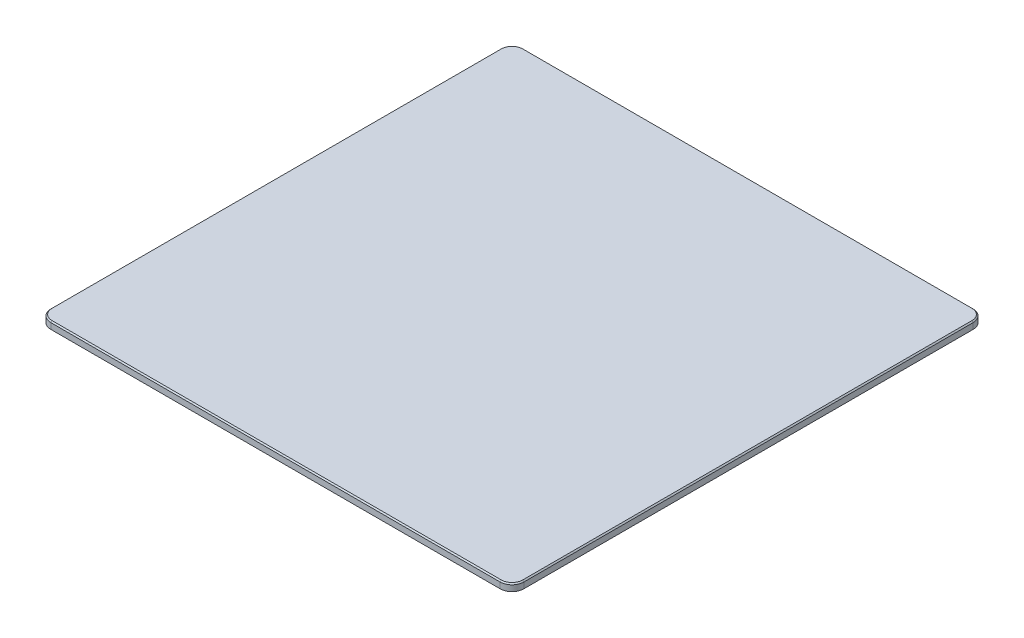
ISO-10303-21;
HEADER;
FILE_DESCRIPTION(('STEP AP214'),'2;1');
FILE_NAME('part.step','',(''),(''),'','','');
FILE_SCHEMA(('AUTOMOTIVE_DESIGN { 1 0 10303 214 1 1 1 1 }'));
ENDSEC;
DATA;
#1=APPLICATION_CONTEXT('core data for automotive mechanical design processes');
#2=APPLICATION_PROTOCOL_DEFINITION('international standard','automotive_design',2000,#1);
#3=PRODUCT_CONTEXT('',#1,'mechanical');
#4=PRODUCT('Part','Part','',(#3));
#5=PRODUCT_RELATED_PRODUCT_CATEGORY('part','',(#4));
#6=PRODUCT_DEFINITION_FORMATION('','',#4);
#7=PRODUCT_DEFINITION_CONTEXT('part definition',#1,'design');
#8=PRODUCT_DEFINITION('design','',#6,#7);
#9=PRODUCT_DEFINITION_SHAPE('','',#8);
#10=(LENGTH_UNIT() NAMED_UNIT(*) SI_UNIT(.MILLI.,.METRE.));
#11=(NAMED_UNIT(*) PLANE_ANGLE_UNIT() SI_UNIT($,.RADIAN.));
#12=(NAMED_UNIT(*) SI_UNIT($,.STERADIAN.) SOLID_ANGLE_UNIT());
#13=UNCERTAINTY_MEASURE_WITH_UNIT(LENGTH_MEASURE(1.E-05),#10,'distance_accuracy_value','');
#14=(GEOMETRIC_REPRESENTATION_CONTEXT(3) GLOBAL_UNCERTAINTY_ASSIGNED_CONTEXT((#13)) GLOBAL_UNIT_ASSIGNED_CONTEXT((#10,
#11,#12)) REPRESENTATION_CONTEXT('',''));
#15=CARTESIAN_POINT('',(0.,0.,0.));
#16=DIRECTION('',(0.,0.,1.));
#17=DIRECTION('',(1.,0.,0.));
#18=AXIS2_PLACEMENT_3D('',#15,#16,#17);
#19=CARTESIAN_POINT('',(100.,3.,100.));
#20=DIRECTION('',(-1.,0.,0.));
#21=DIRECTION('',(0.,0.,1.));
#22=AXIS2_PLACEMENT_3D('',#19,#20,#21);
#23=PLANE('',#22);
#24=DIRECTION('',(0.,-1.,0.));
#25=VECTOR('',#24,1.);
#26=CARTESIAN_POINT('',(100.,3.,-95.));
#27=LINE('',#26,#25);
#28=CARTESIAN_POINT('',(100.,0.,-95.));
#29=VERTEX_POINT('',#28);
#30=CARTESIAN_POINT('',(100.,2.49999999999994,-95.));
#31=VERTEX_POINT('',#30);
#32=EDGE_CURVE('E162',#29,#31,#27,.F.);
#33=ORIENTED_EDGE('',*,*,#32,.T.);
#34=DIRECTION('',(0.,0.,1.));
#35=VECTOR('',#34,1.);
#36=CARTESIAN_POINT('',(100.,2.49999999999994,100.));
#37=LINE('',#36,#35);
#38=CARTESIAN_POINT('',(100.,2.49999999999994,95.));
#39=VERTEX_POINT('',#38);
#40=EDGE_CURVE('E190',#31,#39,#37,.T.);
#41=ORIENTED_EDGE('',*,*,#40,.T.);
#42=DIRECTION('',(0.,-1.,0.));
#43=VECTOR('',#42,1.);
#44=CARTESIAN_POINT('',(100.,3.,95.));
#45=LINE('',#44,#43);
#46=CARTESIAN_POINT('',(100.,0.,95.));
#47=VERTEX_POINT('',#46);
#48=EDGE_CURVE('E160',#39,#47,#45,.T.);
#49=ORIENTED_EDGE('',*,*,#48,.T.);
#50=DIRECTION('',(0.,0.,-1.));
#51=VECTOR('',#50,1.);
#52=CARTESIAN_POINT('',(100.,0.,100.));
#53=LINE('',#52,#51);
#54=EDGE_CURVE('E149',#47,#29,#53,.T.);
#55=ORIENTED_EDGE('',*,*,#54,.T.);
#56=EDGE_LOOP('',(#33,#41,#49,#55));
#57=FACE_BOUND('',#56,.T.);
#58=ADVANCED_FACE('F33',(#57),#23,.F.);
#59=CARTESIAN_POINT('',(-100.,3.,-100.));
#60=DIRECTION('',(0.,0.,1.));
#61=DIRECTION('',(1.,0.,0.));
#62=AXIS2_PLACEMENT_3D('',#59,#60,#61);
#63=PLANE('',#62);
#64=DIRECTION('',(0.,-1.,0.));
#65=VECTOR('',#64,1.);
#66=CARTESIAN_POINT('',(-95.,3.,-100.));
#67=LINE('',#66,#65);
#68=CARTESIAN_POINT('',(-95.,0.,-100.));
#69=VERTEX_POINT('',#68);
#70=CARTESIAN_POINT('',(-95.,2.49999999999994,-100.));
#71=VERTEX_POINT('',#70);
#72=EDGE_CURVE('E134',#69,#71,#67,.F.);
#73=ORIENTED_EDGE('',*,*,#72,.T.);
#74=DIRECTION('',(1.,0.,0.));
#75=VECTOR('',#74,1.);
#76=CARTESIAN_POINT('',(-100.,2.49999999999994,-100.));
#77=LINE('',#76,#75);
#78=CARTESIAN_POINT('',(95.,2.49999999999994,-100.));
#79=VERTEX_POINT('',#78);
#80=EDGE_CURVE('E11',#71,#79,#77,.T.);
#81=ORIENTED_EDGE('',*,*,#80,.T.);
#82=DIRECTION('',(0.,-1.,0.));
#83=VECTOR('',#82,1.);
#84=CARTESIAN_POINT('',(95.,3.,-100.));
#85=LINE('',#84,#83);
#86=CARTESIAN_POINT('',(95.,0.,-100.));
#87=VERTEX_POINT('',#86);
#88=EDGE_CURVE('E138',#79,#87,#85,.T.);
#89=ORIENTED_EDGE('',*,*,#88,.T.);
#90=DIRECTION('',(-1.,0.,0.));
#91=VECTOR('',#90,1.);
#92=CARTESIAN_POINT('',(-100.,0.,-100.));
#93=LINE('',#92,#91);
#94=EDGE_CURVE('E145',#87,#69,#93,.T.);
#95=ORIENTED_EDGE('',*,*,#94,.T.);
#96=EDGE_LOOP('',(#73,#81,#89,#95));
#97=FACE_BOUND('',#96,.T.);
#98=ADVANCED_FACE('F283',(#97),#63,.F.);
#99=CARTESIAN_POINT('',(-100.,3.,100.));
#100=DIRECTION('',(1.,0.,0.));
#101=DIRECTION('',(0.,0.,-1.));
#102=AXIS2_PLACEMENT_3D('',#99,#100,#101);
#103=PLANE('',#102);
#104=DIRECTION('',(0.,-1.,0.));
#105=VECTOR('',#104,1.);
#106=CARTESIAN_POINT('',(-100.,3.,95.));
#107=LINE('',#106,#105);
#108=CARTESIAN_POINT('',(-100.,0.,95.));
#109=VERTEX_POINT('',#108);
#110=CARTESIAN_POINT('',(-100.,2.49999999999994,95.));
#111=VERTEX_POINT('',#110);
#112=EDGE_CURVE('E130',#109,#111,#107,.F.);
#113=ORIENTED_EDGE('',*,*,#112,.T.);
#114=DIRECTION('',(0.,0.,-1.));
#115=VECTOR('',#114,1.);
#116=CARTESIAN_POINT('',(-100.,2.49999999999994,100.));
#117=LINE('',#116,#115);
#118=CARTESIAN_POINT('',(-100.,2.49999999999994,-95.));
#119=VERTEX_POINT('',#118);
#120=EDGE_CURVE('E57',#111,#119,#117,.T.);
#121=ORIENTED_EDGE('',*,*,#120,.T.);
#122=DIRECTION('',(0.,-1.,0.));
#123=VECTOR('',#122,1.);
#124=CARTESIAN_POINT('',(-100.,3.,-95.));
#125=LINE('',#124,#123);
#126=CARTESIAN_POINT('',(-100.,0.,-95.));
#127=VERTEX_POINT('',#126);
#128=EDGE_CURVE('E122',#119,#127,#125,.T.);
#129=ORIENTED_EDGE('',*,*,#128,.T.);
#130=DIRECTION('',(0.,0.,1.));
#131=VECTOR('',#130,1.);
#132=CARTESIAN_POINT('',(-100.,0.,100.));
#133=LINE('',#132,#131);
#134=EDGE_CURVE('E126',#127,#109,#133,.T.);
#135=ORIENTED_EDGE('',*,*,#134,.T.);
#136=EDGE_LOOP('',(#113,#121,#129,#135));
#137=FACE_BOUND('',#136,.T.);
#138=ADVANCED_FACE('F124',(#137),#103,.F.);
#139=CARTESIAN_POINT('',(-100.,3.,100.));
#140=DIRECTION('',(0.,0.,-1.));
#141=DIRECTION('',(-1.,0.,0.));
#142=AXIS2_PLACEMENT_3D('',#139,#140,#141);
#143=PLANE('',#142);
#144=DIRECTION('',(0.,-1.,0.));
#145=VECTOR('',#144,1.);
#146=CARTESIAN_POINT('',(95.,3.,100.));
#147=LINE('',#146,#145);
#148=CARTESIAN_POINT('',(95.,0.,100.));
#149=VERTEX_POINT('',#148);
#150=CARTESIAN_POINT('',(95.,2.49999999999994,100.));
#151=VERTEX_POINT('',#150);
#152=EDGE_CURVE('E167',#149,#151,#147,.F.);
#153=ORIENTED_EDGE('',*,*,#152,.T.);
#154=DIRECTION('',(-1.,0.,0.));
#155=VECTOR('',#154,1.);
#156=CARTESIAN_POINT('',(-100.,2.49999999999994,100.));
#157=LINE('',#156,#155);
#158=CARTESIAN_POINT('',(-95.,2.49999999999994,100.));
#159=VERTEX_POINT('',#158);
#160=EDGE_CURVE('E194',#151,#159,#157,.T.);
#161=ORIENTED_EDGE('',*,*,#160,.T.);
#162=DIRECTION('',(0.,-1.,0.));
#163=VECTOR('',#162,1.);
#164=CARTESIAN_POINT('',(-95.,3.,100.));
#165=LINE('',#164,#163);
#166=CARTESIAN_POINT('',(-95.,0.,100.));
#167=VERTEX_POINT('',#166);
#168=EDGE_CURVE('E165',#159,#167,#165,.T.);
#169=ORIENTED_EDGE('',*,*,#168,.T.);
#170=DIRECTION('',(1.,0.,0.));
#171=VECTOR('',#170,1.);
#172=CARTESIAN_POINT('',(-100.,0.,100.));
#173=LINE('',#172,#171);
#174=EDGE_CURVE('E144',#167,#149,#173,.T.);
#175=ORIENTED_EDGE('',*,*,#174,.T.);
#176=EDGE_LOOP('',(#153,#161,#169,#175));
#177=FACE_BOUND('',#176,.T.);
#178=ADVANCED_FACE('F265',(#177),#143,.F.);
#179=CARTESIAN_POINT('',(0.,3.,0.));
#180=DIRECTION('',(0.,-1.,0.));
#181=DIRECTION('',(0.,0.,-1.));
#182=AXIS2_PLACEMENT_3D('',#179,#180,#181);
#183=PLANE('',#182);
#184=DIRECTION('',(0.,0.,-1.));
#185=VECTOR('',#184,1.);
#186=CARTESIAN_POINT('',(99.4999999999999,3.,0.));
#187=LINE('',#186,#185);
#188=CARTESIAN_POINT('',(99.4999999999999,3.,95.));
#189=VERTEX_POINT('',#188);
#190=CARTESIAN_POINT('',(99.4999999999999,3.,-95.));
#191=VERTEX_POINT('',#190);
#192=EDGE_CURVE('E182',#189,#191,#187,.T.);
#193=ORIENTED_EDGE('',*,*,#192,.T.);
#194=CARTESIAN_POINT('',(95.,3.,-95.));
#195=DIRECTION('',(0.,-1.,0.));
#196=DIRECTION('',(0.,0.,-1.));
#197=AXIS2_PLACEMENT_3D('',#194,#195,#196);
#198=CIRCLE('',#197,4.49999999999995);
#199=CARTESIAN_POINT('',(95.,3.,-99.4999999999999));
#200=VERTEX_POINT('',#199);
#201=EDGE_CURVE('E184',#191,#200,#198,.F.);
#202=ORIENTED_EDGE('',*,*,#201,.T.);
#203=DIRECTION('',(-1.,0.,0.));
#204=VECTOR('',#203,1.);
#205=CARTESIAN_POINT('',(0.,3.,-99.4999999999999));
#206=LINE('',#205,#204);
#207=CARTESIAN_POINT('',(-95.,3.,-99.4999999999999));
#208=VERTEX_POINT('',#207);
#209=EDGE_CURVE('E170',#200,#208,#206,.T.);
#210=ORIENTED_EDGE('',*,*,#209,.T.);
#211=CARTESIAN_POINT('',(-95.,3.,-95.));
#212=DIRECTION('',(0.,-1.,0.));
#213=DIRECTION('',(0.,0.,-1.));
#214=AXIS2_PLACEMENT_3D('',#211,#212,#213);
#215=CIRCLE('',#214,4.49999999999995);
#216=CARTESIAN_POINT('',(-99.5,3.,-95.));
#217=VERTEX_POINT('',#216);
#218=EDGE_CURVE('E172',#208,#217,#215,.F.);
#219=ORIENTED_EDGE('',*,*,#218,.T.);
#220=DIRECTION('',(0.,0.,1.));
#221=VECTOR('',#220,1.);
#222=CARTESIAN_POINT('',(-99.5,3.,0.));
#223=LINE('',#222,#221);
#224=CARTESIAN_POINT('',(-99.5,3.,95.));
#225=VERTEX_POINT('',#224);
#226=EDGE_CURVE('E174',#217,#225,#223,.T.);
#227=ORIENTED_EDGE('',*,*,#226,.T.);
#228=CARTESIAN_POINT('',(-95.,3.,95.));
#229=DIRECTION('',(0.,-1.,0.));
#230=DIRECTION('',(0.,0.,-1.));
#231=AXIS2_PLACEMENT_3D('',#228,#229,#230);
#232=CIRCLE('',#231,4.49999999999995);
#233=CARTESIAN_POINT('',(-95.,3.,99.4999999999999));
#234=VERTEX_POINT('',#233);
#235=EDGE_CURVE('E176',#225,#234,#232,.F.);
#236=ORIENTED_EDGE('',*,*,#235,.T.);
#237=DIRECTION('',(1.,0.,0.));
#238=VECTOR('',#237,1.);
#239=CARTESIAN_POINT('',(0.,3.,99.4999999999999));
#240=LINE('',#239,#238);
#241=CARTESIAN_POINT('',(95.,3.,99.4999999999999));
#242=VERTEX_POINT('',#241);
#243=EDGE_CURVE('E178',#234,#242,#240,.T.);
#244=ORIENTED_EDGE('',*,*,#243,.T.);
#245=CARTESIAN_POINT('',(95.,3.,95.));
#246=DIRECTION('',(0.,-1.,0.));
#247=DIRECTION('',(0.,0.,-1.));
#248=AXIS2_PLACEMENT_3D('',#245,#246,#247);
#249=CIRCLE('',#248,4.49999999999995);
#250=EDGE_CURVE('E180',#242,#189,#249,.F.);
#251=ORIENTED_EDGE('',*,*,#250,.T.);
#252=EDGE_LOOP('',(#193,#202,#210,#219,#227,#236,#244,#251));
#253=FACE_BOUND('',#252,.T.);
#254=ADVANCED_FACE('F249',(#253),#183,.F.);
#255=CARTESIAN_POINT('',(0.,0.,0.));
#256=DIRECTION('',(0.,-1.,0.));
#257=DIRECTION('',(0.,0.,-1.));
#258=AXIS2_PLACEMENT_3D('',#255,#256,#257);
#259=PLANE('',#258);
#260=ORIENTED_EDGE('',*,*,#134,.F.);
#261=CARTESIAN_POINT('',(-95.,0.,-95.));
#262=DIRECTION('',(0.,-1.,0.));
#263=DIRECTION('',(0.,0.,-1.));
#264=AXIS2_PLACEMENT_3D('',#261,#262,#263);
#265=CIRCLE('',#264,5.);
#266=EDGE_CURVE('E132',#127,#69,#265,.T.);
#267=ORIENTED_EDGE('',*,*,#266,.T.);
#268=ORIENTED_EDGE('',*,*,#94,.F.);
#269=CARTESIAN_POINT('',(95.,0.,-95.));
#270=DIRECTION('',(0.,-1.,0.));
#271=DIRECTION('',(0.,0.,-1.));
#272=AXIS2_PLACEMENT_3D('',#269,#270,#271);
#273=CIRCLE('',#272,5.);
#274=EDGE_CURVE('E139',#87,#29,#273,.T.);
#275=ORIENTED_EDGE('',*,*,#274,.T.);
#276=ORIENTED_EDGE('',*,*,#54,.F.);
#277=CARTESIAN_POINT('',(95.,0.,95.));
#278=DIRECTION('',(0.,-1.,0.));
#279=DIRECTION('',(0.,0.,-1.));
#280=AXIS2_PLACEMENT_3D('',#277,#278,#279);
#281=CIRCLE('',#280,5.);
#282=EDGE_CURVE('E155',#47,#149,#281,.T.);
#283=ORIENTED_EDGE('',*,*,#282,.T.);
#284=ORIENTED_EDGE('',*,*,#174,.F.);
#285=CARTESIAN_POINT('',(-95.,0.,95.));
#286=DIRECTION('',(0.,-1.,0.));
#287=DIRECTION('',(0.,0.,-1.));
#288=AXIS2_PLACEMENT_3D('',#285,#286,#287);
#289=CIRCLE('',#288,5.);
#290=EDGE_CURVE('E129',#167,#109,#289,.T.);
#291=ORIENTED_EDGE('',*,*,#290,.T.);
#292=EDGE_LOOP('',(#260,#267,#268,#275,#276,#283,#284,#291));
#293=FACE_BOUND('',#292,.T.);
#294=ADVANCED_FACE('F141',(#293),#259,.T.);
#295=CARTESIAN_POINT('',(-95.,3.,-95.));
#296=DIRECTION('',(0.,-1.,0.));
#297=DIRECTION('',(0.,0.,-1.));
#298=AXIS2_PLACEMENT_3D('',#295,#296,#297);
#299=CYLINDRICAL_SURFACE('',#298,5.);
#300=ORIENTED_EDGE('',*,*,#128,.F.);
#301=CARTESIAN_POINT('',(-95.,2.49999999999994,-95.));
#302=DIRECTION('',(0.,-1.,0.));
#303=DIRECTION('',(0.,0.,-1.));
#304=AXIS2_PLACEMENT_3D('',#301,#302,#303);
#305=CIRCLE('',#304,5.);
#306=EDGE_CURVE('E42',#119,#71,#305,.T.);
#307=ORIENTED_EDGE('',*,*,#306,.T.);
#308=ORIENTED_EDGE('',*,*,#72,.F.);
#309=ORIENTED_EDGE('',*,*,#266,.F.);
#310=EDGE_LOOP('',(#300,#307,#308,#309));
#311=FACE_BOUND('',#310,.T.);
#312=ADVANCED_FACE('F133',(#311),#299,.T.);
#313=CARTESIAN_POINT('',(95.,3.,-95.));
#314=DIRECTION('',(0.,-1.,0.));
#315=DIRECTION('',(0.,0.,-1.));
#316=AXIS2_PLACEMENT_3D('',#313,#314,#315);
#317=CYLINDRICAL_SURFACE('',#316,5.);
#318=ORIENTED_EDGE('',*,*,#88,.F.);
#319=CARTESIAN_POINT('',(95.,2.49999999999994,-95.));
#320=DIRECTION('',(0.,-1.,0.));
#321=DIRECTION('',(0.,0.,-1.));
#322=AXIS2_PLACEMENT_3D('',#319,#320,#321);
#323=CIRCLE('',#322,5.);
#324=EDGE_CURVE('E187',#79,#31,#323,.T.);
#325=ORIENTED_EDGE('',*,*,#324,.T.);
#326=ORIENTED_EDGE('',*,*,#32,.F.);
#327=ORIENTED_EDGE('',*,*,#274,.F.);
#328=EDGE_LOOP('',(#318,#325,#326,#327));
#329=FACE_BOUND('',#328,.T.);
#330=ADVANCED_FACE('F234',(#329),#317,.T.);
#331=CARTESIAN_POINT('',(95.,3.,95.));
#332=DIRECTION('',(0.,-1.,0.));
#333=DIRECTION('',(0.,0.,-1.));
#334=AXIS2_PLACEMENT_3D('',#331,#332,#333);
#335=CYLINDRICAL_SURFACE('',#334,5.);
#336=ORIENTED_EDGE('',*,*,#48,.F.);
#337=CARTESIAN_POINT('',(95.,2.49999999999994,95.));
#338=DIRECTION('',(0.,-1.,0.));
#339=DIRECTION('',(0.,0.,-1.));
#340=AXIS2_PLACEMENT_3D('',#337,#338,#339);
#341=CIRCLE('',#340,5.);
#342=EDGE_CURVE('E192',#39,#151,#341,.T.);
#343=ORIENTED_EDGE('',*,*,#342,.T.);
#344=ORIENTED_EDGE('',*,*,#152,.F.);
#345=ORIENTED_EDGE('',*,*,#282,.F.);
#346=EDGE_LOOP('',(#336,#343,#344,#345));
#347=FACE_BOUND('',#346,.T.);
#348=ADVANCED_FACE('F257',(#347),#335,.T.);
#349=CARTESIAN_POINT('',(-95.,3.,95.));
#350=DIRECTION('',(0.,-1.,0.));
#351=DIRECTION('',(0.,0.,-1.));
#352=AXIS2_PLACEMENT_3D('',#349,#350,#351);
#353=CYLINDRICAL_SURFACE('',#352,5.);
#354=ORIENTED_EDGE('',*,*,#168,.F.);
#355=CARTESIAN_POINT('',(-95.,2.49999999999994,95.));
#356=DIRECTION('',(0.,-1.,0.));
#357=DIRECTION('',(0.,0.,-1.));
#358=AXIS2_PLACEMENT_3D('',#355,#356,#357);
#359=CIRCLE('',#358,5.);
#360=EDGE_CURVE('E196',#159,#111,#359,.T.);
#361=ORIENTED_EDGE('',*,*,#360,.T.);
#362=ORIENTED_EDGE('',*,*,#112,.F.);
#363=ORIENTED_EDGE('',*,*,#290,.F.);
#364=EDGE_LOOP('',(#354,#361,#362,#363));
#365=FACE_BOUND('',#364,.T.);
#366=ADVANCED_FACE('F268',(#365),#353,.T.);
#367=CARTESIAN_POINT('',(-95.,3.,95.));
#368=DIRECTION('',(0.,-1.,0.));
#369=DIRECTION('',(0.,0.,-1.));
#370=AXIS2_PLACEMENT_3D('',#367,#368,#369);
#371=CONICAL_SURFACE('',#370,4.49999999999995,0.785398163397444);
#372=DIRECTION('',(0.707106781186548,0.707106781186548,0.));
#373=VECTOR('',#372,1.);
#374=CARTESIAN_POINT('',(-100.,2.49999999999994,95.));
#375=LINE('',#374,#373);
#376=EDGE_CURVE('E215',#111,#225,#375,.T.);
#377=ORIENTED_EDGE('',*,*,#376,.F.);
#378=ORIENTED_EDGE('',*,*,#360,.F.);
#379=DIRECTION('',(0.,-0.707106781186548,0.707106781186548));
#380=VECTOR('',#379,1.);
#381=CARTESIAN_POINT('',(-95.,3.,99.4999999999999));
#382=LINE('',#381,#380);
#383=EDGE_CURVE('E37',#234,#159,#382,.T.);
#384=ORIENTED_EDGE('',*,*,#383,.F.);
#385=ORIENTED_EDGE('',*,*,#235,.F.);
#386=EDGE_LOOP('',(#377,#378,#384,#385));
#387=FACE_BOUND('',#386,.T.);
#388=ADVANCED_FACE('F35',(#387),#371,.T.);
#389=CARTESIAN_POINT('',(0.,3.,99.4999999999999));
#390=DIRECTION('',(0.,-0.707106781186548,-0.707106781186548));
#391=DIRECTION('',(1.,0.,0.));
#392=AXIS2_PLACEMENT_3D('',#389,#390,#391);
#393=PLANE('',#392);
#394=ORIENTED_EDGE('',*,*,#383,.T.);
#395=ORIENTED_EDGE('',*,*,#160,.F.);
#396=DIRECTION('',(0.,-0.707106781186548,0.707106781186548));
#397=VECTOR('',#396,1.);
#398=CARTESIAN_POINT('',(95.,3.,99.4999999999999));
#399=LINE('',#398,#397);
#400=EDGE_CURVE('E213',#242,#151,#399,.T.);
#401=ORIENTED_EDGE('',*,*,#400,.F.);
#402=ORIENTED_EDGE('',*,*,#243,.F.);
#403=EDGE_LOOP('',(#394,#395,#401,#402));
#404=FACE_BOUND('',#403,.T.);
#405=ADVANCED_FACE('F262',(#404),#393,.F.);
#406=CARTESIAN_POINT('',(-99.5,3.,0.));
#407=DIRECTION('',(0.707106781186548,-0.707106781186548,0.));
#408=DIRECTION('',(0.,0.,1.));
#409=AXIS2_PLACEMENT_3D('',#406,#407,#408);
#410=PLANE('',#409);
#411=ORIENTED_EDGE('',*,*,#376,.T.);
#412=ORIENTED_EDGE('',*,*,#226,.F.);
#413=DIRECTION('',(0.707106781186548,0.707106781186548,0.));
#414=VECTOR('',#413,1.);
#415=CARTESIAN_POINT('',(-100.,2.49999999999994,-95.));
#416=LINE('',#415,#414);
#417=EDGE_CURVE('E210',#119,#217,#416,.T.);
#418=ORIENTED_EDGE('',*,*,#417,.F.);
#419=ORIENTED_EDGE('',*,*,#120,.F.);
#420=EDGE_LOOP('',(#411,#412,#418,#419));
#421=FACE_BOUND('',#420,.T.);
#422=ADVANCED_FACE('F271',(#421),#410,.F.);
#423=CARTESIAN_POINT('',(95.,3.,95.));
#424=DIRECTION('',(0.,-1.,0.));
#425=DIRECTION('',(0.,0.,-1.));
#426=AXIS2_PLACEMENT_3D('',#423,#424,#425);
#427=CONICAL_SURFACE('',#426,4.49999999999995,0.785398163397444);
#428=ORIENTED_EDGE('',*,*,#400,.T.);
#429=ORIENTED_EDGE('',*,*,#342,.F.);
#430=DIRECTION('',(0.707106781186548,-0.707106781186548,0.));
#431=VECTOR('',#430,1.);
#432=CARTESIAN_POINT('',(99.4999999999999,3.,95.));
#433=LINE('',#432,#431);
#434=EDGE_CURVE('E207',#189,#39,#433,.T.);
#435=ORIENTED_EDGE('',*,*,#434,.F.);
#436=ORIENTED_EDGE('',*,*,#250,.F.);
#437=EDGE_LOOP('',(#428,#429,#435,#436));
#438=FACE_BOUND('',#437,.T.);
#439=ADVANCED_FACE('F260',(#438),#427,.T.);
#440=CARTESIAN_POINT('',(-95.,3.,-95.));
#441=DIRECTION('',(0.,-1.,0.));
#442=DIRECTION('',(0.,0.,-1.));
#443=AXIS2_PLACEMENT_3D('',#440,#441,#442);
#444=CONICAL_SURFACE('',#443,4.49999999999995,0.785398163397444);
#445=ORIENTED_EDGE('',*,*,#417,.T.);
#446=ORIENTED_EDGE('',*,*,#218,.F.);
#447=DIRECTION('',(0.,0.707106781186548,0.707106781186548));
#448=VECTOR('',#447,1.);
#449=CARTESIAN_POINT('',(-95.,2.49999999999994,-100.));
#450=LINE('',#449,#448);
#451=EDGE_CURVE('E204',#71,#208,#450,.T.);
#452=ORIENTED_EDGE('',*,*,#451,.F.);
#453=ORIENTED_EDGE('',*,*,#306,.F.);
#454=EDGE_LOOP('',(#445,#446,#452,#453));
#455=FACE_BOUND('',#454,.T.);
#456=ADVANCED_FACE('F273',(#455),#444,.T.);
#457=CARTESIAN_POINT('',(99.4999999999999,3.,0.));
#458=DIRECTION('',(-0.707106781186548,-0.707106781186548,0.));
#459=DIRECTION('',(0.,0.,-1.));
#460=AXIS2_PLACEMENT_3D('',#457,#458,#459);
#461=PLANE('',#460);
#462=ORIENTED_EDGE('',*,*,#434,.T.);
#463=ORIENTED_EDGE('',*,*,#40,.F.);
#464=DIRECTION('',(0.707106781186548,-0.707106781186548,0.));
#465=VECTOR('',#464,1.);
#466=CARTESIAN_POINT('',(99.4999999999999,3.,-95.));
#467=LINE('',#466,#465);
#468=EDGE_CURVE('E202',#191,#31,#467,.T.);
#469=ORIENTED_EDGE('',*,*,#468,.F.);
#470=ORIENTED_EDGE('',*,*,#192,.F.);
#471=EDGE_LOOP('',(#462,#463,#469,#470));
#472=FACE_BOUND('',#471,.T.);
#473=ADVANCED_FACE('F254',(#472),#461,.F.);
#474=CARTESIAN_POINT('',(0.,3.,-99.4999999999999));
#475=DIRECTION('',(0.,-0.707106781186548,0.707106781186548));
#476=DIRECTION('',(-1.,0.,0.));
#477=AXIS2_PLACEMENT_3D('',#474,#475,#476);
#478=PLANE('',#477);
#479=ORIENTED_EDGE('',*,*,#451,.T.);
#480=ORIENTED_EDGE('',*,*,#209,.F.);
#481=DIRECTION('',(0.,0.707106781186548,0.707106781186548));
#482=VECTOR('',#481,1.);
#483=CARTESIAN_POINT('',(95.,2.49999999999994,-100.));
#484=LINE('',#483,#482);
#485=EDGE_CURVE('E200',#79,#200,#484,.T.);
#486=ORIENTED_EDGE('',*,*,#485,.F.);
#487=ORIENTED_EDGE('',*,*,#80,.F.);
#488=EDGE_LOOP('',(#479,#480,#486,#487));
#489=FACE_BOUND('',#488,.T.);
#490=ADVANCED_FACE('F245',(#489),#478,.F.);
#491=CARTESIAN_POINT('',(95.,3.,-95.));
#492=DIRECTION('',(0.,-1.,0.));
#493=DIRECTION('',(0.,0.,-1.));
#494=AXIS2_PLACEMENT_3D('',#491,#492,#493);
#495=CONICAL_SURFACE('',#494,4.49999999999995,0.785398163397444);
#496=ORIENTED_EDGE('',*,*,#468,.T.);
#497=ORIENTED_EDGE('',*,*,#324,.F.);
#498=ORIENTED_EDGE('',*,*,#485,.T.);
#499=ORIENTED_EDGE('',*,*,#201,.F.);
#500=EDGE_LOOP('',(#496,#497,#498,#499));
#501=FACE_BOUND('',#500,.T.);
#502=ADVANCED_FACE('F238',(#501),#495,.T.);
#503=CLOSED_SHELL('',(#58,#98,#138,#178,#254,#294,#312,#330,#348,#366,#388,#405,#422,#439,#456,
#473,#490,#502));
#504=MANIFOLD_SOLID_BREP('B2',#503);
#505=ADVANCED_BREP_SHAPE_REPRESENTATION('',(#18,#504),#14);
#506=SHAPE_DEFINITION_REPRESENTATION(#9,#505);
ENDSEC;
END-ISO-10303-21;
